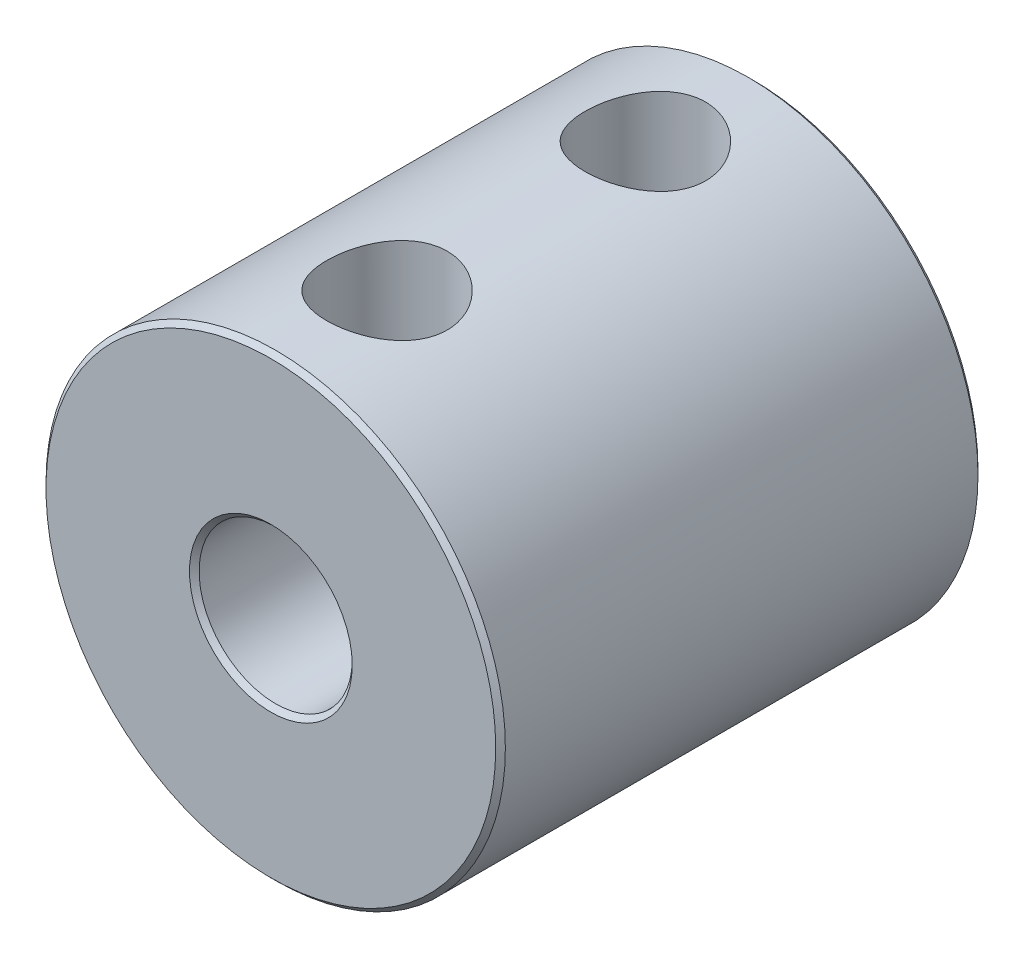
ISO-10303-21;
HEADER;
FILE_DESCRIPTION(('STEP AP214'),'2;1');
FILE_NAME('part.step','',(''),(''),'','','');
FILE_SCHEMA(('AUTOMOTIVE_DESIGN { 1 0 10303 214 1 1 1 1 }'));
ENDSEC;
DATA;
#1=APPLICATION_CONTEXT('core data for automotive mechanical design processes');
#2=APPLICATION_PROTOCOL_DEFINITION('international standard','automotive_design',2000,#1);
#3=PRODUCT_CONTEXT('',#1,'mechanical');
#4=PRODUCT('Part','Part','',(#3));
#5=PRODUCT_RELATED_PRODUCT_CATEGORY('part','',(#4));
#6=PRODUCT_DEFINITION_FORMATION('','',#4);
#7=PRODUCT_DEFINITION_CONTEXT('part definition',#1,'design');
#8=PRODUCT_DEFINITION('design','',#6,#7);
#9=PRODUCT_DEFINITION_SHAPE('','',#8);
#10=(LENGTH_UNIT() NAMED_UNIT(*) SI_UNIT(.MILLI.,.METRE.));
#11=(NAMED_UNIT(*) PLANE_ANGLE_UNIT() SI_UNIT($,.RADIAN.));
#12=(NAMED_UNIT(*) SI_UNIT($,.STERADIAN.) SOLID_ANGLE_UNIT());
#13=UNCERTAINTY_MEASURE_WITH_UNIT(LENGTH_MEASURE(1.E-05),#10,'distance_accuracy_value','');
#14=(GEOMETRIC_REPRESENTATION_CONTEXT(3) GLOBAL_UNCERTAINTY_ASSIGNED_CONTEXT((#13)) GLOBAL_UNIT_ASSIGNED_CONTEXT((#10,
#11,#12)) REPRESENTATION_CONTEXT('',''));
#15=CARTESIAN_POINT('',(0.,0.,0.));
#16=DIRECTION('',(0.,0.,1.));
#17=DIRECTION('',(1.,0.,0.));
#18=AXIS2_PLACEMENT_3D('',#15,#16,#17);
#19=CARTESIAN_POINT('',(0.,0.,0.));
#20=DIRECTION('',(0.,0.,1.));
#21=DIRECTION('',(1.,0.,0.));
#22=AXIS2_PLACEMENT_3D('',#19,#20,#21);
#23=PLANE('',#22);
#24=CARTESIAN_POINT('',(0.,0.,0.));
#25=DIRECTION('',(0.,0.,1.));
#26=DIRECTION('',(1.,0.,0.));
#27=AXIS2_PLACEMENT_3D('',#24,#25,#26);
#28=CIRCLE('',#27,1.5875);
#29=CARTESIAN_POINT('',(1.5875,0.,0.));
#30=VERTEX_POINT('',#29);
#31=EDGE_CURVE('E128',#30,#30,#28,.T.);
#32=ORIENTED_EDGE('',*,*,#31,.T.);
#33=EDGE_LOOP('',(#32));
#34=FACE_BOUND('',#33,.T.);
#35=CARTESIAN_POINT('',(0.,0.,0.));
#36=DIRECTION('',(0.,0.,1.));
#37=DIRECTION('',(1.,0.,0.));
#38=AXIS2_PLACEMENT_3D('',#35,#36,#37);
#39=CIRCLE('',#38,2.);
#40=CARTESIAN_POINT('',(2.,0.,0.));
#41=VERTEX_POINT('',#40);
#42=EDGE_CURVE('E131',#41,#41,#39,.T.);
#43=ORIENTED_EDGE('',*,*,#42,.F.);
#44=EDGE_LOOP('',(#43));
#45=FACE_BOUND('',#44,.T.);
#46=ADVANCED_FACE('F44',(#34,#45),#23,.F.);
#47=CARTESIAN_POINT('',(0.,0.,5.));
#48=DIRECTION('',(0.,0.,1.));
#49=DIRECTION('',(1.,0.,0.));
#50=AXIS2_PLACEMENT_3D('',#47,#48,#49);
#51=PLANE('',#50);
#52=CARTESIAN_POINT('',(0.,0.,5.));
#53=DIRECTION('',(0.,0.,1.));
#54=DIRECTION('',(1.,0.,0.));
#55=AXIS2_PLACEMENT_3D('',#52,#53,#54);
#56=CIRCLE('',#55,1.6875);
#57=CARTESIAN_POINT('',(1.6875,0.,5.));
#58=VERTEX_POINT('',#57);
#59=EDGE_CURVE('E11',#58,#58,#56,.F.);
#60=ORIENTED_EDGE('',*,*,#59,.T.);
#61=EDGE_LOOP('',(#60));
#62=FACE_BOUND('',#61,.T.);
#63=CARTESIAN_POINT('',(0.,0.,5.));
#64=DIRECTION('',(0.,0.,1.));
#65=DIRECTION('',(1.,0.,0.));
#66=AXIS2_PLACEMENT_3D('',#63,#64,#65);
#67=CIRCLE('',#66,4.6625);
#68=CARTESIAN_POINT('',(4.6625,0.,5.));
#69=VERTEX_POINT('',#68);
#70=EDGE_CURVE('E51',#69,#69,#67,.T.);
#71=ORIENTED_EDGE('',*,*,#70,.T.);
#72=EDGE_LOOP('',(#71));
#73=FACE_BOUND('',#72,.T.);
#74=ADVANCED_FACE('F119',(#62,#73),#51,.T.);
#75=CARTESIAN_POINT('',(0.,0.,5.));
#76=DIRECTION('',(0.,0.,-1.));
#77=DIRECTION('',(-1.,0.,0.));
#78=AXIS2_PLACEMENT_3D('',#75,#76,#77);
#79=CYLINDRICAL_SURFACE('',#78,4.7625);
#80=CARTESIAN_POINT('',(0.,0.,-4.9));
#81=DIRECTION('',(0.,0.,1.));
#82=DIRECTION('',(1.,0.,0.));
#83=AXIS2_PLACEMENT_3D('',#80,#81,#82);
#84=CIRCLE('',#83,4.7625);
#85=CARTESIAN_POINT('',(4.7625,0.,-4.9));
#86=VERTEX_POINT('',#85);
#87=EDGE_CURVE('E70',#86,#86,#84,.T.);
#88=ORIENTED_EDGE('',*,*,#87,.T.);
#89=EDGE_LOOP('',(#88));
#90=FACE_BOUND('',#89,.T.);
#91=CARTESIAN_POINT('',(0.,0.,4.9));
#92=DIRECTION('',(0.,0.,1.));
#93=DIRECTION('',(1.,0.,0.));
#94=AXIS2_PLACEMENT_3D('',#91,#92,#93);
#95=CIRCLE('',#94,4.7625);
#96=CARTESIAN_POINT('',(4.7625,0.,4.9));
#97=VERTEX_POINT('',#96);
#98=EDGE_CURVE('E73',#97,#97,#95,.F.);
#99=ORIENTED_EDGE('',*,*,#98,.T.);
#100=EDGE_LOOP('',(#99));
#101=FACE_BOUND('',#100,.T.);
#102=CARTESIAN_POINT('',(0.,4.7625,1.34154505743248));
#103=CARTESIAN_POINT('',(0.0689488269895442,4.76249892350249,1.34154677478449));
#104=CARTESIAN_POINT('',(0.137916249732853,4.7609879135257,1.34726892954829));
#105=CARTESIAN_POINT('',(0.273866948453046,4.75510685303733,1.36996745850493));
#106=CARTESIAN_POINT('',(0.340849208276611,4.75073536386706,1.38694949583683));
#107=CARTESIAN_POINT('',(0.470847324819607,4.73961624911542,1.43157961425417));
#108=CARTESIAN_POINT('',(0.533868088670451,4.73287163434153,1.45921418459318));
#109=CARTESIAN_POINT('',(0.654380149036168,4.71772047020068,1.52431549104405));
#110=CARTESIAN_POINT('',(0.711871122906725,4.70931382394719,1.56178280038761));
#111=CARTESIAN_POINT('',(0.820986470277107,4.69153581720156,1.64637706172664));
#112=CARTESIAN_POINT('',(0.872468553444091,4.68214837483676,1.69368417485623));
#113=CARTESIAN_POINT('',(0.966866884789409,4.66357097403559,1.79622988718229));
#114=CARTESIAN_POINT('',(1.00978206633533,4.65438104031723,1.85146947255048));
#115=CARTESIAN_POINT('',(1.08651582428672,4.63707529018651,1.96943987504178));
#116=CARTESIAN_POINT('',(1.12017187342694,4.6289797969026,2.03227966229696));
#117=CARTESIAN_POINT('',(1.17638558308836,4.61501548950118,2.16297248521194));
#118=CARTESIAN_POINT('',(1.1989452192048,4.60914627906091,2.23082462600088));
#119=CARTESIAN_POINT('',(1.23183379886141,4.60046491688714,2.36804307970433));
#120=CARTESIAN_POINT('',(1.24242017860249,4.59758852991802,2.4373435284335));
#121=CARTESIAN_POINT('',(1.25186415000504,4.59502647971797,2.57679189214129));
#122=CARTESIAN_POINT('',(1.25072385935279,4.59534024038719,2.64693965182113));
#123=CARTESIAN_POINT('',(1.2369514988369,4.59906547949983,2.78409148400784));
#124=CARTESIAN_POINT('',(1.22462970188497,4.60239331631598,2.85112934462741));
#125=CARTESIAN_POINT('',(1.1893405287158,4.61163798030708,2.98215130073156));
#126=CARTESIAN_POINT('',(1.16637232540632,4.61755500862773,3.04613515853238));
#127=CARTESIAN_POINT('',(1.11018652844068,4.63138572997379,3.17004757314024));
#128=CARTESIAN_POINT('',(1.0768591778707,4.63932063065523,3.22992389573517));
#129=CARTESIAN_POINT('',(1.00097774509561,4.65628148655067,3.34334380572385));
#130=CARTESIAN_POINT('',(0.958421898098478,4.66530765030378,3.3968861788272));
#131=CARTESIAN_POINT('',(0.863699684388385,4.68378320724794,3.49789243082112));
#132=CARTESIAN_POINT('',(0.81127243212953,4.69323696794646,3.54511119078582));
#133=CARTESIAN_POINT('',(0.699128555580208,4.71124674232189,3.63013575935315));
#134=CARTESIAN_POINT('',(0.63941166161862,4.71980272276478,3.66794121956523));
#135=CARTESIAN_POINT('',(0.514011757722161,4.73510285261534,3.73316929368063));
#136=CARTESIAN_POINT('',(0.448305300721087,4.741839433184,3.76054872225757));
#137=CARTESIAN_POINT('',(0.313005240952779,4.75268695115514,3.8038028776617));
#138=CARTESIAN_POINT('',(0.243412463556182,4.75679844378087,3.8196800373896));
#139=CARTESIAN_POINT('',(0.104408120703844,4.76184902928973,3.83909680744724));
#140=CARTESIAN_POINT('',(0.0350461696468031,4.76287382691041,3.84296981429992));
#141=CARTESIAN_POINT('',(-0.103335803501143,4.76188136816725,3.83918743173574));
#142=CARTESIAN_POINT('',(-0.172355859057596,4.75986441568581,3.83153319393458));
#143=CARTESIAN_POINT('',(-0.306912963279037,4.7530703319408,3.80518742548859));
#144=CARTESIAN_POINT('',(-0.372488766286749,4.74833947030658,3.78668080322463));
#145=CARTESIAN_POINT('',(-0.499599496842097,4.73665325835687,3.73936941834594));
#146=CARTESIAN_POINT('',(-0.561133992851571,4.72969767094507,3.71056355806921));
#147=CARTESIAN_POINT('',(-0.679718836805752,4.71413156698966,3.64284587469196));
#148=CARTESIAN_POINT('',(-0.736660907636648,4.70549194189252,3.60375129731607));
#149=CARTESIAN_POINT('',(-0.843293871093426,4.68755697205324,3.51679666169126));
#150=CARTESIAN_POINT('',(-0.892983374645437,4.67826150220249,3.46893492822947));
#151=CARTESIAN_POINT('',(-0.98509768785537,4.65974890421523,3.36425063057284));
#152=CARTESIAN_POINT('',(-1.02728759830267,4.65054081563012,3.30721939939391));
#153=CARTESIAN_POINT('',(-1.10150190977155,4.63352511650848,3.18669306437901));
#154=CARTESIAN_POINT('',(-1.13352674443343,4.62571744623654,3.12319823643158));
#155=CARTESIAN_POINT('',(-1.18626077762451,4.61247560327066,2.99187151589232));
#156=CARTESIAN_POINT('',(-1.20703611666267,4.6070275958912,2.9240676516713));
#157=CARTESIAN_POINT('',(-1.23684299798427,4.59911599923542,2.78576231770744));
#158=CARTESIAN_POINT('',(-1.24587742774386,4.59665167618308,2.71526151562277));
#159=CARTESIAN_POINT('',(-1.25178379299122,4.59504639964925,2.57596462022732));
#160=CARTESIAN_POINT('',(-1.24903271196827,4.59580243207658,2.50718545526061));
#161=CARTESIAN_POINT('',(-1.23231761019831,4.60031226908765,2.37110869719326));
#162=CARTESIAN_POINT('',(-1.21835386109659,4.60406600104719,2.30381106824057));
#163=CARTESIAN_POINT('',(-1.17982517655742,4.61408795675081,2.17306553343907));
#164=CARTESIAN_POINT('',(-1.15533776233217,4.62033777009164,2.10959327341467));
#165=CARTESIAN_POINT('',(-1.09651728065576,4.6346486625493,1.98761062922558));
#166=CARTESIAN_POINT('',(-1.0621827134925,4.64271001752169,1.92910100262536));
#167=CARTESIAN_POINT('',(-0.983489925232751,4.66002342411813,1.8168992843486));
#168=CARTESIAN_POINT('',(-0.938873327565304,4.66930291627763,1.76339261434521));
#169=CARTESIAN_POINT('',(-0.841377495724143,4.68785113845598,1.66450320738799));
#170=CARTESIAN_POINT('',(-0.788496268453519,4.69711986533407,1.61912243575396));
#171=CARTESIAN_POINT('',(-0.674662319319912,4.71482962144215,1.53685915606817));
#172=CARTESIAN_POINT('',(-0.613566194670512,4.72324975484127,1.50017021539746));
#173=CARTESIAN_POINT('',(-0.485855224781154,4.73808723116027,1.43764206580491));
#174=CARTESIAN_POINT('',(-0.419244063470448,4.74450589757513,1.41179568318439));
#175=CARTESIAN_POINT('',(-0.294038318804133,4.75375633848032,1.37517827759368));
#176=CARTESIAN_POINT('',(-0.235998618132914,4.75701167518968,1.3625945813639));
#177=CARTESIAN_POINT('',(-0.118643789063093,4.7613838704496,1.34577761762647));
#178=CARTESIAN_POINT('',(-0.0593287788483258,4.76250092629978,1.34154357969309));
#179=CARTESIAN_POINT('',(0.,4.7625,1.34154505743248));
#180=B_SPLINE_CURVE_WITH_KNOTS('',3,(#102,#103,#104,#105,#106,#107,#108,#109,#110,#111,#112,
#113,#114,#115,#116,#117,#118,#119,#120,#121,#122,#123,#124,#125,#126,#127,#128,#129,#130,#131,
#132,#133,#134,#135,#136,#137,#138,#139,#140,#141,#142,#143,#144,#145,#146,#147,#148,#149,#150,
#151,#152,#153,#154,#155,#156,#157,#158,#159,#160,#161,#162,#163,#164,#165,#166,#167,#168,#169,
#170,#171,#172,#173,#174,#175,#176,#177,#178,#179),.UNSPECIFIED.,.T.,.F.,(4,2,2,2,2,2,2,2,2,2,2,
2,2,2,2,2,2,2,2,2,2,2,2,2,2,2,2,2,2,2,2,2,2,2,2,2,2,2,4),(0.,0.206628947540085,
0.413361897673241,0.619833503863802,0.826317149667349,1.03697999238148,1.24766904759021,
1.46184949115504,1.67599178841439,1.88543667630244,2.09484374179414,2.29861197653731,
2.50239604417055,2.70841740289267,2.91447819447151,3.12704121112375,3.33961209366172,
3.55305412213803,3.76645099126343,3.97386542536041,4.18125913933898,4.38521782999525,
4.5891982644418,4.79708014026651,5.00500177931067,5.21859009069133,5.43216928920837,
5.64447874168108,5.85673597038202,6.06225528548327,6.26776962169215,6.47179533639975,
6.67585214054692,6.88573951059615,7.09567757538118,7.30992507905381,7.52403060697185,
7.70184616919216,7.87964532354365),.UNSPECIFIED.);
#181=CARTESIAN_POINT('',(0.,4.7625,1.34154505743248));
#182=VERTEX_POINT('',#181);
#183=EDGE_CURVE('E76',#182,#182,#180,.T.);
#184=ORIENTED_EDGE('',*,*,#183,.T.);
#185=EDGE_LOOP('',(#184));
#186=FACE_BOUND('',#185,.T.);
#187=CARTESIAN_POINT('',(0.,4.7625,-4.01475886589839));
#188=CARTESIAN_POINT('',(0.0689488269895442,4.76249892350249,-4.01475714854638));
#189=CARTESIAN_POINT('',(0.137916249732853,4.7609879135257,-4.00903499378258));
#190=CARTESIAN_POINT('',(0.273866948453046,4.75510685303733,-3.98633646482594));
#191=CARTESIAN_POINT('',(0.340849208276611,4.75073536386706,-3.96935442749405));
#192=CARTESIAN_POINT('',(0.470847324819607,4.73961624911542,-3.9247243090767));
#193=CARTESIAN_POINT('',(0.533868088670451,4.73287163434153,-3.89708973873769));
#194=CARTESIAN_POINT('',(0.654380149036167,4.71772047020068,-3.83198843228682));
#195=CARTESIAN_POINT('',(0.711871122906725,4.70931382394719,-3.79452112294327));
#196=CARTESIAN_POINT('',(0.820986470277107,4.69153581720156,-3.70992686160423));
#197=CARTESIAN_POINT('',(0.872468553444091,4.68214837483676,-3.66261974847464));
#198=CARTESIAN_POINT('',(0.966866884789408,4.66357097403559,-3.56007403614858));
#199=CARTESIAN_POINT('',(1.00978206633533,4.65438104031723,-3.50483445078039));
#200=CARTESIAN_POINT('',(1.08651582428672,4.63707529018651,-3.38686404828909));
#201=CARTESIAN_POINT('',(1.12017187342694,4.6289797969026,-3.32402426103391));
#202=CARTESIAN_POINT('',(1.17638558308836,4.61501548950118,-3.19333143811893));
#203=CARTESIAN_POINT('',(1.1989452192048,4.60914627906091,-3.12547929732999));
#204=CARTESIAN_POINT('',(1.23183379886141,4.60046491688714,-2.98826084362654));
#205=CARTESIAN_POINT('',(1.24242017860249,4.59758852991802,-2.91896039489737));
#206=CARTESIAN_POINT('',(1.25186415000504,4.59502647971797,-2.77951203118958));
#207=CARTESIAN_POINT('',(1.25072385935279,4.59534024038719,-2.70936427150974));
#208=CARTESIAN_POINT('',(1.2369514988369,4.59906547949983,-2.57221243932303));
#209=CARTESIAN_POINT('',(1.22462970188497,4.60239331631598,-2.50517457870346));
#210=CARTESIAN_POINT('',(1.1893405287158,4.61163798030708,-2.37415262259932));
#211=CARTESIAN_POINT('',(1.16637232540632,4.61755500862773,-2.31016876479849));
#212=CARTESIAN_POINT('',(1.11018652844068,4.63138572997379,-2.18625635019063));
#213=CARTESIAN_POINT('',(1.0768591778707,4.63932063065523,-2.1263800275957));
#214=CARTESIAN_POINT('',(1.00097774509561,4.65628148655067,-2.01296011760702));
#215=CARTESIAN_POINT('',(0.958421898098478,4.66530765030378,-1.95941774450367));
#216=CARTESIAN_POINT('',(0.863699684388385,4.68378320724794,-1.85841149250976));
#217=CARTESIAN_POINT('',(0.81127243212953,4.69323696794646,-1.81119273254505));
#218=CARTESIAN_POINT('',(0.699128555580208,4.71124674232189,-1.72616816397772));
#219=CARTESIAN_POINT('',(0.63941166161862,4.71980272276478,-1.68836270376564));
#220=CARTESIAN_POINT('',(0.514011757722161,4.73510285261534,-1.62313462965024));
#221=CARTESIAN_POINT('',(0.448305300721088,4.741839433184,-1.59575520107331));
#222=CARTESIAN_POINT('',(0.31300524095278,4.75268695115514,-1.55250104566918));
#223=CARTESIAN_POINT('',(0.243412463556182,4.75679844378087,-1.53662388594127));
#224=CARTESIAN_POINT('',(0.104408120703845,4.76184902928973,-1.51720711588363));
#225=CARTESIAN_POINT('',(0.0350461696468037,4.76287382691041,-1.51333410903095));
#226=CARTESIAN_POINT('',(-0.103335803501143,4.76188136816725,-1.51711649159513));
#227=CARTESIAN_POINT('',(-0.172355859057595,4.75986441568581,-1.52477072939629));
#228=CARTESIAN_POINT('',(-0.306912963279037,4.7530703319408,-1.55111649784228));
#229=CARTESIAN_POINT('',(-0.372488766286749,4.74833947030658,-1.56962312010624));
#230=CARTESIAN_POINT('',(-0.499599496842097,4.73665325835687,-1.61693450498493));
#231=CARTESIAN_POINT('',(-0.561133992851571,4.72969767094507,-1.64574036526166));
#232=CARTESIAN_POINT('',(-0.679718836805752,4.71413156698966,-1.71345804863891));
#233=CARTESIAN_POINT('',(-0.736660907636648,4.70549194189252,-1.7525526260148));
#234=CARTESIAN_POINT('',(-0.843293871093426,4.68755697205324,-1.83950726163961));
#235=CARTESIAN_POINT('',(-0.892983374645438,4.67826150220249,-1.8873689951014));
#236=CARTESIAN_POINT('',(-0.98509768785537,4.65974890421523,-1.99205329275803));
#237=CARTESIAN_POINT('',(-1.02728759830267,4.65054081563012,-2.04908452393696));
#238=CARTESIAN_POINT('',(-1.10150190977155,4.63352511650848,-2.16961085895186));
#239=CARTESIAN_POINT('',(-1.13352674443343,4.62571744623654,-2.23310568689929));
#240=CARTESIAN_POINT('',(-1.18626077762451,4.61247560327066,-2.36443240743855));
#241=CARTESIAN_POINT('',(-1.20703611666267,4.6070275958912,-2.43223627165957));
#242=CARTESIAN_POINT('',(-1.23684299798427,4.59911599923542,-2.57054160562344));
#243=CARTESIAN_POINT('',(-1.24587742774386,4.59665167618307,-2.64104240770811));
#244=CARTESIAN_POINT('',(-1.25178379299122,4.59504639964925,-2.78033930310355));
#245=CARTESIAN_POINT('',(-1.24903271196827,4.59580243207657,-2.84911846807026));
#246=CARTESIAN_POINT('',(-1.23231761019831,4.60031226908765,-2.98519522613761));
#247=CARTESIAN_POINT('',(-1.21835386109659,4.60406600104719,-3.0524928550903));
#248=CARTESIAN_POINT('',(-1.17982517655742,4.61408795675081,-3.1832383898918));
#249=CARTESIAN_POINT('',(-1.15533776233217,4.62033777009164,-3.2467106499162));
#250=CARTESIAN_POINT('',(-1.09651728065576,4.6346486625493,-3.3686932941053));
#251=CARTESIAN_POINT('',(-1.0621827134925,4.64271001752169,-3.42720292070551));
#252=CARTESIAN_POINT('',(-0.983489925232751,4.66002342411813,-3.53940463898227));
#253=CARTESIAN_POINT('',(-0.938873327565304,4.66930291627763,-3.59291130898566));
#254=CARTESIAN_POINT('',(-0.841377495724143,4.68785113845598,-3.69180071594288));
#255=CARTESIAN_POINT('',(-0.788496268453519,4.69711986533407,-3.73718148757692));
#256=CARTESIAN_POINT('',(-0.674662319319912,4.71482962144215,-3.8194447672627));
#257=CARTESIAN_POINT('',(-0.613566194670513,4.72324975484127,-3.85613370793341));
#258=CARTESIAN_POINT('',(-0.485855224781155,4.73808723116027,-3.91866185752596));
#259=CARTESIAN_POINT('',(-0.419244063470448,4.74450589757513,-3.94450824014648));
#260=CARTESIAN_POINT('',(-0.294038318804133,4.75375633848032,-3.98112564573719));
#261=CARTESIAN_POINT('',(-0.235998618132914,4.75701167518968,-3.99370934196698));
#262=CARTESIAN_POINT('',(-0.118643789063094,4.7613838704496,-4.0105263057044));
#263=CARTESIAN_POINT('',(-0.0593287788483259,4.76250092629978,-4.01476034363778));
#264=CARTESIAN_POINT('',(0.,4.7625,-4.01475886589839));
#265=B_SPLINE_CURVE_WITH_KNOTS('',3,(#187,#188,#189,#190,#191,#192,#193,#194,#195,#196,#197,
#198,#199,#200,#201,#202,#203,#204,#205,#206,#207,#208,#209,#210,#211,#212,#213,#214,#215,#216,
#217,#218,#219,#220,#221,#222,#223,#224,#225,#226,#227,#228,#229,#230,#231,#232,#233,#234,#235,
#236,#237,#238,#239,#240,#241,#242,#243,#244,#245,#246,#247,#248,#249,#250,#251,#252,#253,#254,
#255,#256,#257,#258,#259,#260,#261,#262,#263,#264),.UNSPECIFIED.,.T.,.F.,(4,2,2,2,2,2,2,2,2,2,2,
2,2,2,2,2,2,2,2,2,2,2,2,2,2,2,2,2,2,2,2,2,2,2,2,2,2,2,4),(0.,0.206628947540085,
0.413361897673241,0.619833503863801,0.826317149667349,1.03697999238148,1.24766904759021,
1.46184949115504,1.67599178841439,1.88543667630244,2.09484374179414,2.29861197653731,
2.50239604417055,2.70841740289267,2.91447819447151,3.12704121112375,3.33961209366172,
3.55305412213803,3.76645099126343,3.97386542536041,4.18125913933898,4.38521782999525,
4.5891982644418,4.79708014026651,5.00500177931067,5.21859009069133,5.43216928920837,
5.64447874168109,5.85673597038202,6.06225528548327,6.26776962169215,6.47179533639975,
6.67585214054692,6.88573951059616,7.09567757538118,7.30992507905381,7.52403060697185,
7.70184616919216,7.87964532354365),.UNSPECIFIED.);
#266=CARTESIAN_POINT('',(0.,4.7625,-4.01475886589839));
#267=VERTEX_POINT('',#266);
#268=EDGE_CURVE('E83',#267,#267,#265,.T.);
#269=ORIENTED_EDGE('',*,*,#268,.T.);
#270=EDGE_LOOP('',(#269));
#271=FACE_BOUND('',#270,.T.);
#272=ADVANCED_FACE('F88',(#90,#101,#186,#271),#79,.T.);
#273=CARTESIAN_POINT('',(0.,0.,5.));
#274=DIRECTION('',(0.,0.,-1.));
#275=DIRECTION('',(-1.,0.,0.));
#276=AXIS2_PLACEMENT_3D('',#273,#274,#275);
#277=CYLINDRICAL_SURFACE('',#276,1.5875);
#278=CARTESIAN_POINT('',(0.,0.,4.9));
#279=DIRECTION('',(0.,0.,1.));
#280=DIRECTION('',(1.,0.,0.));
#281=AXIS2_PLACEMENT_3D('',#278,#279,#280);
#282=CIRCLE('',#281,1.5875);
#283=CARTESIAN_POINT('',(1.5875,0.,4.9));
#284=VERTEX_POINT('',#283);
#285=EDGE_CURVE('E55',#284,#284,#282,.T.);
#286=ORIENTED_EDGE('',*,*,#285,.T.);
#287=EDGE_LOOP('',(#286));
#288=FACE_BOUND('',#287,.T.);
#289=CARTESIAN_POINT('',(0.,1.5875,1.34154505743248));
#290=CARTESIAN_POINT('',(0.0602718578585088,1.58749523297836,1.34154997926149));
#291=CARTESIAN_POINT('',(0.120622829139981,1.58403248046648,1.34593974976258));
#292=CARTESIAN_POINT('',(0.239386349602183,1.57049101098605,1.36320746925874));
#293=CARTESIAN_POINT('',(0.29779473986171,1.56039895281631,1.37610253502092));
#294=CARTESIAN_POINT('',(0.410639962394015,1.53455587559765,1.40946377534127));
#295=CARTESIAN_POINT('',(0.465099060028607,1.51884012876568,1.42988278236826));
#296=CARTESIAN_POINT('',(0.569409661276581,1.48289548692968,1.47729175713164));
#297=CARTESIAN_POINT('',(0.619260922753111,1.46266635494255,1.50428206991258));
#298=CARTESIAN_POINT('',(0.729959834712182,1.41144915191171,1.57405950942904));
#299=CARTESIAN_POINT('',(0.788779045539373,1.37914210630621,1.61909698010815));
#300=CARTESIAN_POINT('',(0.896858564613748,1.31144350150316,1.7177466856718));
#301=CARTESIAN_POINT('',(0.946090708798861,1.27604328396869,1.77138336542086));
#302=CARTESIAN_POINT('',(1.03528609032457,1.20483789384733,1.88719126908968));
#303=CARTESIAN_POINT('',(1.07510267553984,1.16903440386775,1.94947620499782));
#304=CARTESIAN_POINT('',(1.14381731084228,1.10187273324568,2.08192200166349));
#305=CARTESIAN_POINT('',(1.17275298509172,1.07049947320552,2.15205461411613));
#306=CARTESIAN_POINT('',(1.2086348619723,1.02945375441494,2.26943970731909));
#307=CARTESIAN_POINT('',(1.21972526116764,1.0161743845064,2.31414436600917));
#308=CARTESIAN_POINT('',(1.23698200742578,0.995097448779298,2.40570776026864));
#309=CARTESIAN_POINT('',(1.24316011617705,0.987286794394754,2.45256106474003));
#310=CARTESIAN_POINT('',(1.25014589852032,0.978431955373873,2.54770355379435));
#311=CARTESIAN_POINT('',(1.25091223034083,0.977439860771846,2.59600096723777));
#312=CARTESIAN_POINT('',(1.24688558561496,0.982568063723961,2.69199902233569));
#313=CARTESIAN_POINT('',(1.24208697411623,0.988695570458616,2.73969900957596));
#314=CARTESIAN_POINT('',(1.2260538790342,1.00852952651633,2.84132583326834));
#315=CARTESIAN_POINT('',(1.21383144747012,1.02338449139904,2.89486237501462));
#316=CARTESIAN_POINT('',(1.18322220380174,1.05862386087572,2.99825159464383));
#317=CARTESIAN_POINT('',(1.16481785441515,1.07902396452785,3.04809329410142));
#318=CARTESIAN_POINT('',(1.1129839869909,1.13285897773982,3.16562095423126));
#319=CARTESIAN_POINT('',(1.07652414242959,1.16801456702997,3.23117342591174));
#320=CARTESIAN_POINT('',(0.993076260522238,1.23976017837518,3.35432681893726));
#321=CARTESIAN_POINT('',(0.946074273416566,1.27635204755042,3.41191703960572));
#322=CARTESIAN_POINT('',(0.840756809778635,1.34812152005002,3.51966865262112));
#323=CARTESIAN_POINT('',(0.782232101482606,1.3832556617428,3.56965660995457));
#324=CARTESIAN_POINT('',(0.654941113566778,1.44784982869823,3.65904669708514));
#325=CARTESIAN_POINT('',(0.586204080289831,1.47732552360855,3.69847818362225));
#326=CARTESIAN_POINT('',(0.461280522475493,1.51999129105341,3.754705815533));
#327=CARTESIAN_POINT('',(0.407316055513152,1.53542265061627,3.7747489900829));
#328=CARTESIAN_POINT('',(0.295926705528417,1.56071601459029,3.80739294413959));
#329=CARTESIAN_POINT('',(0.238504496892603,1.57058226361952,3.81999939611672));
#330=CARTESIAN_POINT('',(0.121447273353927,1.58394777655032,3.83704196651867));
#331=CARTESIAN_POINT('',(0.0618035307071649,1.58741844422562,3.84144139036527));
#332=CARTESIAN_POINT('',(-0.0575091007280402,1.58757865153304,3.84164503610681));
#333=CARTESIAN_POINT('',(-0.117177987851001,1.58426858580429,3.83744975821398));
#334=CARTESIAN_POINT('',(-0.230523551184645,1.57163767124941,3.82134623115983));
#335=CARTESIAN_POINT('',(-0.284329659207481,1.5627471731898,3.80998995523012));
#336=CARTESIAN_POINT('',(-0.389015523723114,1.54003081853651,3.78071438658874));
#337=CARTESIAN_POINT('',(-0.439894574522502,1.52620377751821,3.76279351880784));
#338=CARTESIAN_POINT('',(-0.541527969202418,1.49330775761418,3.7196064980258));
#339=CARTESIAN_POINT('',(-0.591986671820934,1.4739233722789,3.69389019733325));
#340=CARTESIAN_POINT('',(-0.68791954794106,1.43166866250908,3.63671943371738));
#341=CARTESIAN_POINT('',(-0.733391515800157,1.40879680616493,3.60526244793446));
#342=CARTESIAN_POINT('',(-0.827400685147444,1.35609787375437,3.53078466778833));
#343=CARTESIAN_POINT('',(-0.874822469046593,1.32578211792372,3.48670435226571));
#344=CARTESIAN_POINT('',(-0.962056889540396,1.26390883508819,3.39222603829665));
#345=CARTESIAN_POINT('',(-1.0018585838889,1.23234959968437,3.34181912433161));
#346=CARTESIAN_POINT('',(-1.07295402858524,1.17093533101684,3.23595866040094));
#347=CARTESIAN_POINT('',(-1.10438436835229,1.14106014853687,3.18060875808641));
#348=CARTESIAN_POINT('',(-1.15903744802574,1.08549474840214,3.06404705725027));
#349=CARTESIAN_POINT('',(-1.18227735598003,1.05979583853397,3.00284786616162));
#350=CARTESIAN_POINT('',(-1.21337314973531,1.02384504643812,2.89530833775502));
#351=CARTESIAN_POINT('',(-1.2237724437052,1.01128227124794,2.8504940533993));
#352=CARTESIAN_POINT('',(-1.23962208775717,0.991793455483454,2.75884413547585));
#353=CARTESIAN_POINT('',(-1.24508367993718,0.984854614157089,2.71201334925306));
#354=CARTESIAN_POINT('',(-1.25064355030078,0.977789176872647,2.61717819820813));
#355=CARTESIAN_POINT('',(-1.25070619338315,0.977707843128619,2.56916812778558));
#356=CARTESIAN_POINT('',(-1.24537125795938,0.984490502562607,2.47393137059199));
#357=CARTESIAN_POINT('',(-1.23996708505456,0.991362883727658,2.42670569993757));
#358=CARTESIAN_POINT('',(-1.22249610405077,1.01285883803983,2.32467467383906));
#359=CARTESIAN_POINT('',(-1.20926898198989,1.0288065187101,2.27035879966851));
#360=CARTESIAN_POINT('',(-1.17648624558153,1.06613906136307,2.16562216742411));
#361=CARTESIAN_POINT('',(-1.15691255391645,1.08753941678387,2.11521305153695));
#362=CARTESIAN_POINT('',(-1.10230178487286,1.14332725518229,1.99712745868296));
#363=CARTESIAN_POINT('',(-1.06424918242705,1.17928963980639,1.93159549764435));
#364=CARTESIAN_POINT('',(-0.977402709524267,1.25222893889784,1.80869957005751));
#365=CARTESIAN_POINT('',(-0.928596138982478,1.289207007275,1.75134539423232));
#366=CARTESIAN_POINT('',(-0.81964801598129,1.36112666400753,1.644667872694));
#367=CARTESIAN_POINT('',(-0.75934219680104,1.396027705587,1.59548308416465));
#368=CARTESIAN_POINT('',(-0.628397528746216,1.45963397438775,1.50814107525217));
#369=CARTESIAN_POINT('',(-0.55778723021468,1.48835579507462,1.46995422545217));
#370=CARTESIAN_POINT('',(-0.431118731654119,1.52880746629474,1.41690137097346));
#371=CARTESIAN_POINT('',(-0.377338151320378,1.54304457322414,1.39847569890244));
#372=CARTESIAN_POINT('',(-0.266715071576926,1.56594570492613,1.36899947608873));
#373=CARTESIAN_POINT('',(-0.209880552580348,1.57462355605534,1.35793062569208));
#374=CARTESIAN_POINT('',(-0.127127763323576,1.58260550769983,1.34776589545679));
#375=CARTESIAN_POINT('',(-0.101800296756735,1.58443663546253,1.34543744986769));
#376=CARTESIAN_POINT('',(-0.0509866320881206,1.58688503768855,1.34232580172506));
#377=CARTESIAN_POINT('',(-0.0255003968860315,1.58750201687733,1.34154297505776));
#378=CARTESIAN_POINT('',(0.,1.5875,1.34154505743248));
#379=B_SPLINE_CURVE_WITH_KNOTS('',3,(#289,#290,#291,#292,#293,#294,#295,#296,#297,#298,#299,
#300,#301,#302,#303,#304,#305,#306,#307,#308,#309,#310,#311,#312,#313,#314,#315,#316,#317,#318,
#319,#320,#321,#322,#323,#324,#325,#326,#327,#328,#329,#330,#331,#332,#333,#334,#335,#336,#337,
#338,#339,#340,#341,#342,#343,#344,#345,#346,#347,#348,#349,#350,#351,#352,#353,#354,#355,#356,
#357,#358,#359,#360,#361,#362,#363,#364,#365,#366,#367,#368,#369,#370,#371,#372,#373,#374,#375,
#376,#377,#378),.UNSPECIFIED.,.T.,.F.,(4,2,2,2,2,2,2,2,2,2,2,2,2,2,2,2,2,2,2,2,2,2,2,2,2,2,2,2,
2,2,2,2,2,2,2,2,2,2,2,2,2,2,2,2,4),(0.,0.180705004698692,0.361774789420072,0.541728242850526,
0.721691147272417,0.96287604686896,1.20475912982156,1.45019249040193,1.69476920909993,
1.83809292232272,1.98107242782212,2.12514301558385,2.26935961386416,2.43907620049361,
2.60927837507448,2.85651337343475,3.10407747300339,3.35663915867389,3.60849101673471,
3.78656525901459,3.96450349630877,4.14323542682454,4.32195695542552,4.48835091243659,
4.65478481920461,4.83370327683354,5.01270055396379,5.22640721242151,5.44041848331827,
5.65068787540065,5.86051386093996,6.00307409531732,6.14530892689068,6.28848249060747,
6.43182896497705,6.60526138297801,6.77919220372909,7.02954299848933,7.28019104930581,
7.53473180894234,7.78858025744904,7.96370859006003,8.138399654631,8.21483547825181,
8.29128988836683),.UNSPECIFIED.);
#380=CARTESIAN_POINT('',(0.,1.5875,1.34154505743248));
#381=VERTEX_POINT('',#380);
#382=EDGE_CURVE('E102',#381,#381,#379,.T.);
#383=ORIENTED_EDGE('',*,*,#382,.F.);
#384=EDGE_LOOP('',(#383));
#385=FACE_BOUND('',#384,.T.);
#386=ORIENTED_EDGE('',*,*,#31,.F.);
#387=EDGE_LOOP('',(#386));
#388=FACE_BOUND('',#387,.T.);
#389=ADVANCED_FACE('F112',(#288,#385,#388),#277,.F.);
#390=CARTESIAN_POINT('',(0.,0.,-5.));
#391=DIRECTION('',(0.,0.,1.));
#392=DIRECTION('',(1.,0.,0.));
#393=AXIS2_PLACEMENT_3D('',#390,#391,#392);
#394=PLANE('',#393);
#395=CARTESIAN_POINT('',(0.,0.,-5.));
#396=DIRECTION('',(0.,0.,1.));
#397=DIRECTION('',(1.,0.,0.));
#398=AXIS2_PLACEMENT_3D('',#395,#396,#397);
#399=CIRCLE('',#398,4.6625);
#400=CARTESIAN_POINT('',(4.6625,0.,-5.));
#401=VERTEX_POINT('',#400);
#402=EDGE_CURVE('E64',#401,#401,#399,.F.);
#403=ORIENTED_EDGE('',*,*,#402,.T.);
#404=EDGE_LOOP('',(#403));
#405=FACE_BOUND('',#404,.T.);
#406=CARTESIAN_POINT('',(0.,0.,-5.));
#407=DIRECTION('',(0.,0.,1.));
#408=DIRECTION('',(1.,0.,0.));
#409=AXIS2_PLACEMENT_3D('',#406,#407,#408);
#410=CIRCLE('',#409,2.1);
#411=CARTESIAN_POINT('',(2.1,0.,-5.));
#412=VERTEX_POINT('',#411);
#413=EDGE_CURVE('E67',#412,#412,#410,.T.);
#414=ORIENTED_EDGE('',*,*,#413,.T.);
#415=EDGE_LOOP('',(#414));
#416=FACE_BOUND('',#415,.T.);
#417=ADVANCED_FACE('F117',(#405,#416),#394,.F.);
#418=CARTESIAN_POINT('',(0.,0.,-5.));
#419=DIRECTION('',(0.,0.,1.));
#420=DIRECTION('',(1.,0.,0.));
#421=AXIS2_PLACEMENT_3D('',#418,#419,#420);
#422=CYLINDRICAL_SURFACE('',#421,2.);
#423=CARTESIAN_POINT('',(0.,0.,-4.9));
#424=DIRECTION('',(0.,0.,1.));
#425=DIRECTION('',(1.,0.,0.));
#426=AXIS2_PLACEMENT_3D('',#423,#424,#425);
#427=CIRCLE('',#426,2.);
#428=CARTESIAN_POINT('',(2.,0.,-4.9));
#429=VERTEX_POINT('',#428);
#430=EDGE_CURVE('E59',#429,#429,#427,.F.);
#431=ORIENTED_EDGE('',*,*,#430,.T.);
#432=EDGE_LOOP('',(#431));
#433=FACE_BOUND('',#432,.T.);
#434=CARTESIAN_POINT('',(0.,2.,-4.01475886589839));
#435=CARTESIAN_POINT('',(-0.0635104730002023,1.99999595305313,-4.01475451589961));
#436=CARTESIAN_POINT('',(-0.127096441053757,1.99694323311001,-4.00988585408058));
#437=CARTESIAN_POINT('',(-0.252318262265281,1.98502167724102,-3.99067306246889));
#438=CARTESIAN_POINT('',(-0.313950163299072,1.97614175574896,-3.97631087197291));
#439=CARTESIAN_POINT('',(-0.433205558136781,1.95345852982135,-3.93894750273634));
#440=CARTESIAN_POINT('',(-0.490847243665014,1.93967960778663,-3.91598907805751));
#441=CARTESIAN_POINT('',(-0.601260368868357,1.90834598486073,-3.86237301510164));
#442=CARTESIAN_POINT('',(-0.654032347276149,1.89079170235271,-3.8317162298892));
#443=CARTESIAN_POINT('',(-0.75797419216797,1.85170152902273,-3.76087229271342));
#444=CARTESIAN_POINT('',(-0.808679560769973,1.82995962224617,-3.72011956592294));
#445=CARTESIAN_POINT('',(-0.902986375146755,1.78531349913632,-3.63153969139184));
#446=CARTESIAN_POINT('',(-0.946578107215729,1.76240774858553,-3.58370303764045));
#447=CARTESIAN_POINT('',(-1.03142873237132,1.71430418655199,-3.47472497169388));
#448=CARTESIAN_POINT('',(-1.0715720602915,1.68921610993413,-3.41265907929112));
#449=CARTESIAN_POINT('',(-1.14073966020039,1.64330198128732,-3.28119405045121));
#450=CARTESIAN_POINT('',(-1.16978270899534,1.62246875996239,-3.21180755332232));
#451=CARTESIAN_POINT('',(-1.2093340058598,1.59309575627365,-3.08594834211968));
#452=CARTESIAN_POINT('',(-1.22269552371393,1.58276905990074,-3.03079204735958));
#453=CARTESIAN_POINT('',(-1.24181843585479,1.56781357325806,-2.9184529402876));
#454=CARTESIAN_POINT('',(-1.24759056342087,1.56317673673693,-2.86127310762391));
#455=CARTESIAN_POINT('',(-1.25118918245719,1.56029885782828,-2.74634584914728));
#456=CARTESIAN_POINT('',(-1.2489948372785,1.56207458771719,-2.688597329436));
#457=CARTESIAN_POINT('',(-1.23676317046804,1.57177402383921,-2.57444876270944));
#458=CARTESIAN_POINT('',(-1.22671956265043,1.57970265767111,-2.51804983385932));
#459=CARTESIAN_POINT('',(-1.19968103371473,1.60032573121781,-2.40932041324092));
#460=CARTESIAN_POINT('',(-1.18285016736896,1.61290715104815,-2.35692641021413));
#461=CARTESIAN_POINT('',(-1.14290189820937,1.64145566443406,-2.25559768349298));
#462=CARTESIAN_POINT('',(-1.11978227193695,1.65742395501354,-2.2066641910239));
#463=CARTESIAN_POINT('',(-1.06294892954948,1.6945481599302,-2.10392559206566));
#464=CARTESIAN_POINT('',(-1.0280629660117,1.7161159157596,-2.05091805577801));
#465=CARTESIAN_POINT('',(-0.950881463002094,1.76005711791244,-1.95092858689792));
#466=CARTESIAN_POINT('',(-0.908578308011429,1.78243137335976,-1.90395293419188));
#467=CARTESIAN_POINT('',(-0.809519713023324,1.82979894916857,-1.80945711652801));
#468=CARTESIAN_POINT('',(-0.751531353595326,1.85461531676593,-1.76312589163957));
#469=CARTESIAN_POINT('',(-0.627148099593563,1.90028055062445,-1.68090797001115));
#470=CARTESIAN_POINT('',(-0.560756523881992,1.92113097514764,-1.64501716816947));
#471=CARTESIAN_POINT('',(-0.424883562934742,1.95553372961317,-1.58699517751698));
#472=CARTESIAN_POINT('',(-0.355763457732365,1.96941976591574,-1.56422482591722));
#473=CARTESIAN_POINT('',(-0.213612154574971,1.98984929310048,-1.53099393791559));
#474=CARTESIAN_POINT('',(-0.140586648341301,1.9964031799007,-1.5205159716764));
#475=CARTESIAN_POINT('',(-0.00451561874058586,2.00097840540091,-1.51319301583721));
#476=CARTESIAN_POINT('',(0.058402774163787,2.00012161345511,-1.51455568794455));
#477=CARTESIAN_POINT('',(0.182972117996311,1.99258901494327,-1.52664169431913));
#478=CARTESIAN_POINT('',(0.244623154962735,1.98591360473592,-1.53736439099057));
#479=CARTESIAN_POINT('',(0.362521070658191,1.9677405228307,-1.56699740259036));
#480=CARTESIAN_POINT('',(0.418885009953205,1.95644170526844,-1.58557102269505));
#481=CARTESIAN_POINT('',(0.527638281070988,1.92995684104752,-1.63005525517697));
#482=CARTESIAN_POINT('',(0.580026945470715,1.91477014350267,-1.65596709615356));
#483=CARTESIAN_POINT('',(0.685084056277256,1.87990012356001,-1.71727407189389));
#484=CARTESIAN_POINT('',(0.737246967843403,1.85991764817225,-1.75336243513664));
#485=CARTESIAN_POINT('',(0.835142640217339,1.81806970001717,-1.83255273105121));
#486=CARTESIAN_POINT('',(0.880868151291852,1.79620214826384,-1.87566245515294));
#487=CARTESIAN_POINT('',(0.971474198022881,1.74905869713092,-1.97489390531106));
#488=CARTESIAN_POINT('',(1.01526851939752,1.72374883414957,-2.03199607219319));
#489=CARTESIAN_POINT('',(1.09280351885684,1.67566762748173,-2.15363465084266));
#490=CARTESIAN_POINT('',(1.12655115718693,1.65289453322337,-2.2181658726514));
#491=CARTESIAN_POINT('',(1.17684772011827,1.61733530314593,-2.33945101395528));
#492=CARTESIAN_POINT('',(1.19551895865479,1.6034563619378,-2.39499961663062));
#493=CARTESIAN_POINT('',(1.22500108205244,1.58105030663768,-2.50915201166732));
#494=CARTESIAN_POINT('',(1.23582424983127,1.57251483242606,-2.56775087534987));
#495=CARTESIAN_POINT('',(1.24901383653654,1.56206324988732,-2.68684914277909));
#496=CARTESIAN_POINT('',(1.25133186963292,1.5601850167457,-2.74735745138658));
#497=CARTESIAN_POINT('',(1.24719778716817,1.56349063109848,-2.86788982626444));
#498=CARTESIAN_POINT('',(1.24074275650142,1.56867682595587,-2.92791372490792));
#499=CARTESIAN_POINT('',(1.22038272403399,1.58455388771335,-3.04078866094976));
#500=CARTESIAN_POINT('',(1.20711919499769,1.59476808051061,-3.09382816731482));
#501=CARTESIAN_POINT('',(1.17417623469512,1.61917530435691,-3.19689392548431));
#502=CARTESIAN_POINT('',(1.15449412799406,1.63336999423728,-3.24691891043591));
#503=CARTESIAN_POINT('',(1.10602690439617,1.66663902886519,-3.3503556097711));
#504=CARTESIAN_POINT('',(1.07633644455459,1.68612230498998,-3.40320916437495));
#505=CARTESIAN_POINT('',(1.01000017036388,1.72667706411869,-3.50369723314441));
#506=CARTESIAN_POINT('',(0.973348732866932,1.74774982276826,-3.55132747845888));
#507=CARTESIAN_POINT('',(0.885670221416051,1.79401910731182,-3.64977312087624));
#508=CARTESIAN_POINT('',(0.833233674246786,1.81920541808777,-3.69934971134388));
#509=CARTESIAN_POINT('',(0.719822446025195,1.86698729056749,-3.78925369560364));
#510=CARTESIAN_POINT('',(0.65884251513854,1.88958124364395,-3.8295753618258));
#511=CARTESIAN_POINT('',(0.529355399891398,1.92986710976549,-3.89952999602249));
#512=CARTESIAN_POINT('',(0.460835727056561,1.94755071355357,-3.92914487130424));
#513=CARTESIAN_POINT('',(0.31839471272949,1.97581521637843,-3.97583075023014));
#514=CARTESIAN_POINT('',(0.244493501106841,1.98642121428689,-3.99294610076817));
#515=CARTESIAN_POINT('',(0.141418481224657,1.99519472168143,-4.00705807506102));
#516=CARTESIAN_POINT('',(0.113248608862864,1.99699172226301,-4.00994073123236));
#517=CARTESIAN_POINT('',(0.0567241864870865,1.9993953021324,-4.01379215743599));
#518=CARTESIAN_POINT('',(0.0283696251514511,2.00000180773911,-4.01476080900838));
#519=CARTESIAN_POINT('',(0.,2.,-4.01475886589839));
#520=B_SPLINE_CURVE_WITH_KNOTS('',3,(#434,#435,#436,#437,#438,#439,#440,#441,#442,#443,#444,
#445,#446,#447,#448,#449,#450,#451,#452,#453,#454,#455,#456,#457,#458,#459,#460,#461,#462,#463,
#464,#465,#466,#467,#468,#469,#470,#471,#472,#473,#474,#475,#476,#477,#478,#479,#480,#481,#482,
#483,#484,#485,#486,#487,#488,#489,#490,#491,#492,#493,#494,#495,#496,#497,#498,#499,#500,#501,
#502,#503,#504,#505,#506,#507,#508,#509,#510,#511,#512,#513,#514,#515,#516,#517,#518,#519),
.UNSPECIFIED.,.T.,.F.,(4,2,2,2,2,2,2,2,2,2,2,2,2,2,2,2,2,2,2,2,2,2,2,2,2,2,2,2,2,2,2,2,2,2,2,2,
2,2,2,2,2,2,4),(0.,0.190412301434132,0.38118789412846,0.571026987595134,0.760845054038792,
0.965821870536214,1.17107628325701,1.40412975852973,1.6367872460701,1.80912008879716,
1.9812089470739,2.15374823498777,2.32642584505082,2.49515839460435,2.66395067908032,
2.86427450354358,3.0648052257518,3.2984218069952,3.53194640727859,3.75284174135957,
3.97342347958129,4.16127180597571,4.34910733732278,4.52959504531296,4.71011298928464,
4.9088523099055,5.10781368827683,5.3356570886371,5.56334227196908,5.74329940313717,
5.92297427413349,6.10366974688198,6.28442527563861,6.45063169037738,6.61690747313439,
6.80725523036975,6.99775741153766,7.22600539035108,7.45439424578496,7.68316725607074,
7.91112460944404,7.99617501232476,8.08123067890583),.UNSPECIFIED.);
#521=CARTESIAN_POINT('',(0.,2.,-4.01475886589839));
#522=VERTEX_POINT('',#521);
#523=EDGE_CURVE('E108',#522,#522,#520,.T.);
#524=ORIENTED_EDGE('',*,*,#523,.T.);
#525=EDGE_LOOP('',(#524));
#526=FACE_BOUND('',#525,.T.);
#527=ORIENTED_EDGE('',*,*,#42,.T.);
#528=EDGE_LOOP('',(#527));
#529=FACE_BOUND('',#528,.T.);
#530=ADVANCED_FACE('F137',(#433,#526,#529),#422,.F.);
#531=CARTESIAN_POINT('',(0.,0.,-2.7647588658984));
#532=DIRECTION('',(0.,-1.,0.));
#533=DIRECTION('',(0.,0.,-1.));
#534=AXIS2_PLACEMENT_3D('',#531,#532,#533);
#535=CYLINDRICAL_SURFACE('',#534,1.24999999999999);
#536=ORIENTED_EDGE('',*,*,#268,.F.);
#537=EDGE_LOOP('',(#536));
#538=FACE_BOUND('',#537,.T.);
#539=ORIENTED_EDGE('',*,*,#523,.F.);
#540=EDGE_LOOP('',(#539));
#541=FACE_BOUND('',#540,.T.);
#542=ADVANCED_FACE('F96',(#538,#541),#535,.F.);
#543=CARTESIAN_POINT('',(0.,0.,2.59154505743247));
#544=DIRECTION('',(0.,-1.,0.));
#545=DIRECTION('',(0.,0.,-1.));
#546=AXIS2_PLACEMENT_3D('',#543,#544,#545);
#547=CYLINDRICAL_SURFACE('',#546,1.24999999999999);
#548=ORIENTED_EDGE('',*,*,#382,.T.);
#549=EDGE_LOOP('',(#548));
#550=FACE_BOUND('',#549,.T.);
#551=ORIENTED_EDGE('',*,*,#183,.F.);
#552=EDGE_LOOP('',(#551));
#553=FACE_BOUND('',#552,.T.);
#554=ADVANCED_FACE('F92',(#550,#553),#547,.F.);
#555=CARTESIAN_POINT('',(0.,0.,-4.9));
#556=DIRECTION('',(0.,0.,1.));
#557=DIRECTION('',(1.,0.,0.));
#558=AXIS2_PLACEMENT_3D('',#555,#556,#557);
#559=CONICAL_SURFACE('',#558,4.7625,0.785398163397457);
#560=ORIENTED_EDGE('',*,*,#402,.F.);
#561=EDGE_LOOP('',(#560));
#562=FACE_BOUND('',#561,.T.);
#563=ORIENTED_EDGE('',*,*,#87,.F.);
#564=EDGE_LOOP('',(#563));
#565=FACE_BOUND('',#564,.T.);
#566=ADVANCED_FACE('F95',(#562,#565),#559,.T.);
#567=CARTESIAN_POINT('',(0.,0.,-5.));
#568=DIRECTION('',(0.,0.,-1.));
#569=DIRECTION('',(-1.,0.,0.));
#570=AXIS2_PLACEMENT_3D('',#567,#568,#569);
#571=CONICAL_SURFACE('',#570,2.1,0.78539816339744);
#572=ORIENTED_EDGE('',*,*,#430,.F.);
#573=EDGE_LOOP('',(#572));
#574=FACE_BOUND('',#573,.T.);
#575=ORIENTED_EDGE('',*,*,#413,.F.);
#576=EDGE_LOOP('',(#575));
#577=FACE_BOUND('',#576,.T.);
#578=ADVANCED_FACE('F164',(#574,#577),#571,.F.);
#579=CARTESIAN_POINT('',(0.,0.,4.9));
#580=DIRECTION('',(0.,0.,1.));
#581=DIRECTION('',(1.,0.,0.));
#582=AXIS2_PLACEMENT_3D('',#579,#580,#581);
#583=CONICAL_SURFACE('',#582,1.5875,0.785398163397448);
#584=ORIENTED_EDGE('',*,*,#59,.F.);
#585=EDGE_LOOP('',(#584));
#586=FACE_BOUND('',#585,.T.);
#587=ORIENTED_EDGE('',*,*,#285,.F.);
#588=EDGE_LOOP('',(#587));
#589=FACE_BOUND('',#588,.T.);
#590=ADVANCED_FACE('F160',(#586,#589),#583,.F.);
#591=CARTESIAN_POINT('',(0.,0.,5.));
#592=DIRECTION('',(0.,0.,-1.));
#593=DIRECTION('',(-1.,0.,0.));
#594=AXIS2_PLACEMENT_3D('',#591,#592,#593);
#595=CONICAL_SURFACE('',#594,4.6625,0.785398163397461);
#596=ORIENTED_EDGE('',*,*,#98,.F.);
#597=EDGE_LOOP('',(#596));
#598=FACE_BOUND('',#597,.T.);
#599=ORIENTED_EDGE('',*,*,#70,.F.);
#600=EDGE_LOOP('',(#599));
#601=FACE_BOUND('',#600,.T.);
#602=ADVANCED_FACE('F46',(#598,#601),#595,.T.);
#603=CLOSED_SHELL('',(#46,#74,#272,#389,#417,#530,#542,#554,#566,#578,#590,#602));
#604=MANIFOLD_SOLID_BREP('B2',#603);
#605=ADVANCED_BREP_SHAPE_REPRESENTATION('',(#18,#604),#14);
#606=SHAPE_DEFINITION_REPRESENTATION(#9,#605);
ENDSEC;
END-ISO-10303-21;
